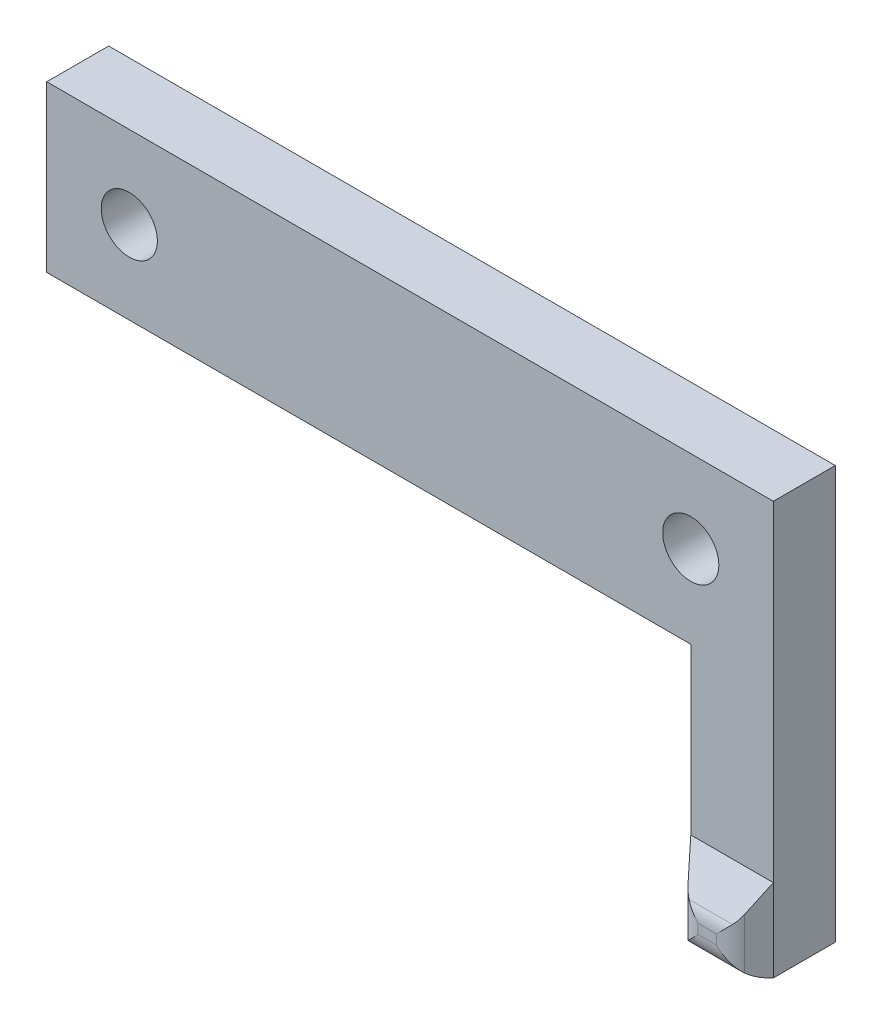
ISO-10303-21;
HEADER;
FILE_DESCRIPTION(('STEP AP214'),'2;1');
FILE_NAME('part.step','',(''),(''),'','','');
FILE_SCHEMA(('AUTOMOTIVE_DESIGN { 1 0 10303 214 1 1 1 1 }'));
ENDSEC;
DATA;
#1=APPLICATION_CONTEXT('core data for automotive mechanical design processes');
#2=APPLICATION_PROTOCOL_DEFINITION('international standard','automotive_design',2000,#1);
#3=PRODUCT_CONTEXT('',#1,'mechanical');
#4=PRODUCT('Part','Part','',(#3));
#5=PRODUCT_RELATED_PRODUCT_CATEGORY('part','',(#4));
#6=PRODUCT_DEFINITION_FORMATION('','',#4);
#7=PRODUCT_DEFINITION_CONTEXT('part definition',#1,'design');
#8=PRODUCT_DEFINITION('design','',#6,#7);
#9=PRODUCT_DEFINITION_SHAPE('','',#8);
#10=(LENGTH_UNIT() NAMED_UNIT(*) SI_UNIT(.MILLI.,.METRE.));
#11=(NAMED_UNIT(*) PLANE_ANGLE_UNIT() SI_UNIT($,.RADIAN.));
#12=(NAMED_UNIT(*) SI_UNIT($,.STERADIAN.) SOLID_ANGLE_UNIT());
#13=UNCERTAINTY_MEASURE_WITH_UNIT(LENGTH_MEASURE(1.E-05),#10,'distance_accuracy_value','');
#14=(GEOMETRIC_REPRESENTATION_CONTEXT(3) GLOBAL_UNCERTAINTY_ASSIGNED_CONTEXT((#13)) GLOBAL_UNIT_ASSIGNED_CONTEXT((#10,
#11,#12)) REPRESENTATION_CONTEXT('',''));
#15=CARTESIAN_POINT('',(0.,0.,0.));
#16=DIRECTION('',(0.,0.,1.));
#17=DIRECTION('',(1.,0.,0.));
#18=AXIS2_PLACEMENT_3D('',#15,#16,#17);
#19=CARTESIAN_POINT('',(78.,-10.,7.5));
#20=DIRECTION('',(0.,1.,0.));
#21=DIRECTION('',(0.,0.,1.));
#22=AXIS2_PLACEMENT_3D('',#19,#20,#21);
#23=PLANE('',#22);
#24=DIRECTION('',(0.,0.,-1.));
#25=VECTOR('',#24,1.);
#26=CARTESIAN_POINT('',(68.,-10.,7.5));
#27=LINE('',#26,#25);
#28=CARTESIAN_POINT('',(68.,-10.,7.5));
#29=VERTEX_POINT('',#28);
#30=CARTESIAN_POINT('',(68.,-10.,0.));
#31=VERTEX_POINT('',#30);
#32=EDGE_CURVE('E238',#29,#31,#27,.T.);
#33=ORIENTED_EDGE('',*,*,#32,.F.);
#34=DIRECTION('',(1.,0.,0.));
#35=VECTOR('',#34,1.);
#36=CARTESIAN_POINT('',(78.,-10.,7.5));
#37=LINE('',#36,#35);
#38=CARTESIAN_POINT('',(-10.,-10.,7.5));
#39=VERTEX_POINT('',#38);
#40=EDGE_CURVE('E161',#39,#29,#37,.T.);
#41=ORIENTED_EDGE('',*,*,#40,.F.);
#42=DIRECTION('',(0.,0.,-1.));
#43=VECTOR('',#42,1.);
#44=CARTESIAN_POINT('',(-10.,-10.,7.5));
#45=LINE('',#44,#43);
#46=CARTESIAN_POINT('',(-10.,-10.,0.));
#47=VERTEX_POINT('',#46);
#48=EDGE_CURVE('E190',#39,#47,#45,.T.);
#49=ORIENTED_EDGE('',*,*,#48,.T.);
#50=DIRECTION('',(1.,0.,0.));
#51=VECTOR('',#50,1.);
#52=CARTESIAN_POINT('',(78.,-10.,0.));
#53=LINE('',#52,#51);
#54=EDGE_CURVE('E259',#47,#31,#53,.T.);
#55=ORIENTED_EDGE('',*,*,#54,.T.);
#56=EDGE_LOOP('',(#33,#41,#49,#55));
#57=FACE_BOUND('',#56,.T.);
#58=ADVANCED_FACE('F47',(#57),#23,.F.);
#59=CARTESIAN_POINT('',(0.,0.,7.5));
#60=DIRECTION('',(0.,0.,-1.));
#61=DIRECTION('',(-1.,0.,0.));
#62=AXIS2_PLACEMENT_3D('',#59,#60,#61);
#63=PLANE('',#62);
#64=DIRECTION('',(0.,1.,0.));
#65=VECTOR('',#64,1.);
#66=CARTESIAN_POINT('',(68.,-40.,7.5));
#67=LINE('',#66,#65);
#68=CARTESIAN_POINT('',(68.,-30.,7.5));
#69=VERTEX_POINT('',#68);
#70=EDGE_CURVE('E157',#69,#29,#67,.T.);
#71=ORIENTED_EDGE('',*,*,#70,.F.);
#72=DIRECTION('',(-1.,0.,0.));
#73=VECTOR('',#72,1.);
#74=CARTESIAN_POINT('',(78.,-30.,7.5));
#75=LINE('',#74,#73);
#76=CARTESIAN_POINT('',(78.,-30.,7.5));
#77=VERTEX_POINT('',#76);
#78=EDGE_CURVE('E138',#77,#69,#75,.T.);
#79=ORIENTED_EDGE('',*,*,#78,.F.);
#80=DIRECTION('',(0.,1.,0.));
#81=VECTOR('',#80,1.);
#82=CARTESIAN_POINT('',(78.,10.,7.5));
#83=LINE('',#82,#81);
#84=CARTESIAN_POINT('',(78.,10.,7.5));
#85=VERTEX_POINT('',#84);
#86=EDGE_CURVE('E186',#77,#85,#83,.T.);
#87=ORIENTED_EDGE('',*,*,#86,.T.);
#88=DIRECTION('',(-1.,0.,0.));
#89=VECTOR('',#88,1.);
#90=CARTESIAN_POINT('',(78.,10.,7.5));
#91=LINE('',#90,#89);
#92=CARTESIAN_POINT('',(-10.,10.,7.5));
#93=VERTEX_POINT('',#92);
#94=EDGE_CURVE('E185',#85,#93,#91,.T.);
#95=ORIENTED_EDGE('',*,*,#94,.T.);
#96=DIRECTION('',(0.,-1.,0.));
#97=VECTOR('',#96,1.);
#98=CARTESIAN_POINT('',(-10.,10.,7.5));
#99=LINE('',#98,#97);
#100=EDGE_CURVE('E256',#93,#39,#99,.T.);
#101=ORIENTED_EDGE('',*,*,#100,.T.);
#102=ORIENTED_EDGE('',*,*,#40,.T.);
#103=EDGE_LOOP('',(#71,#79,#87,#95,#101,#102));
#104=FACE_BOUND('',#103,.T.);
#105=CARTESIAN_POINT('',(0.,0.,7.5));
#106=DIRECTION('',(0.,0.,1.));
#107=DIRECTION('',(1.,0.,0.));
#108=AXIS2_PLACEMENT_3D('',#105,#106,#107);
#109=CIRCLE('',#108,3.4);
#110=CARTESIAN_POINT('',(3.4,0.,7.5));
#111=VERTEX_POINT('',#110);
#112=EDGE_CURVE('E264',#111,#111,#109,.T.);
#113=ORIENTED_EDGE('',*,*,#112,.F.);
#114=EDGE_LOOP('',(#113));
#115=FACE_BOUND('',#114,.T.);
#116=CARTESIAN_POINT('',(68.,0.,7.5));
#117=DIRECTION('',(0.,0.,1.));
#118=DIRECTION('',(1.,0.,0.));
#119=AXIS2_PLACEMENT_3D('',#116,#117,#118);
#120=CIRCLE('',#119,3.4);
#121=CARTESIAN_POINT('',(71.4,0.,7.5));
#122=VERTEX_POINT('',#121);
#123=EDGE_CURVE('E272',#122,#122,#120,.T.);
#124=ORIENTED_EDGE('',*,*,#123,.F.);
#125=EDGE_LOOP('',(#124));
#126=FACE_BOUND('',#125,.T.);
#127=ADVANCED_FACE('F158',(#104,#115,#126),#63,.F.);
#128=CARTESIAN_POINT('',(0.,0.,0.));
#129=DIRECTION('',(0.,0.,-1.));
#130=DIRECTION('',(-1.,0.,0.));
#131=AXIS2_PLACEMENT_3D('',#128,#129,#130);
#132=PLANE('',#131);
#133=CARTESIAN_POINT('',(0.,0.,0.));
#134=DIRECTION('',(0.,0.,1.));
#135=DIRECTION('',(1.,0.,0.));
#136=AXIS2_PLACEMENT_3D('',#133,#134,#135);
#137=CIRCLE('',#136,3.4);
#138=CARTESIAN_POINT('',(3.4,0.,0.));
#139=VERTEX_POINT('',#138);
#140=EDGE_CURVE('E269',#139,#139,#137,.T.);
#141=ORIENTED_EDGE('',*,*,#140,.T.);
#142=EDGE_LOOP('',(#141));
#143=FACE_BOUND('',#142,.T.);
#144=DIRECTION('',(0.,-1.,0.));
#145=VECTOR('',#144,1.);
#146=CARTESIAN_POINT('',(-10.,10.,0.));
#147=LINE('',#146,#145);
#148=CARTESIAN_POINT('',(-10.,10.,0.));
#149=VERTEX_POINT('',#148);
#150=EDGE_CURVE('E261',#149,#47,#147,.T.);
#151=ORIENTED_EDGE('',*,*,#150,.F.);
#152=DIRECTION('',(-1.,0.,0.));
#153=VECTOR('',#152,1.);
#154=CARTESIAN_POINT('',(78.,10.,0.));
#155=LINE('',#154,#153);
#156=CARTESIAN_POINT('',(78.,10.,0.));
#157=VERTEX_POINT('',#156);
#158=EDGE_CURVE('E254',#157,#149,#155,.T.);
#159=ORIENTED_EDGE('',*,*,#158,.F.);
#160=DIRECTION('',(0.,1.,0.));
#161=VECTOR('',#160,1.);
#162=CARTESIAN_POINT('',(78.,10.,0.));
#163=LINE('',#162,#161);
#164=CARTESIAN_POINT('',(78.,-40.,0.));
#165=VERTEX_POINT('',#164);
#166=EDGE_CURVE('E257',#165,#157,#163,.T.);
#167=ORIENTED_EDGE('',*,*,#166,.F.);
#168=DIRECTION('',(1.,0.,0.));
#169=VECTOR('',#168,1.);
#170=CARTESIAN_POINT('',(68.,-40.,0.));
#171=LINE('',#170,#169);
#172=CARTESIAN_POINT('',(68.,-40.,0.));
#173=VERTEX_POINT('',#172);
#174=EDGE_CURVE('E236',#173,#165,#171,.T.);
#175=ORIENTED_EDGE('',*,*,#174,.F.);
#176=DIRECTION('',(0.,1.,0.));
#177=VECTOR('',#176,1.);
#178=CARTESIAN_POINT('',(68.,-40.,0.));
#179=LINE('',#178,#177);
#180=EDGE_CURVE('E171',#173,#31,#179,.T.);
#181=ORIENTED_EDGE('',*,*,#180,.T.);
#182=ORIENTED_EDGE('',*,*,#54,.F.);
#183=EDGE_LOOP('',(#151,#159,#167,#175,#181,#182));
#184=FACE_BOUND('',#183,.T.);
#185=CARTESIAN_POINT('',(68.,0.,0.));
#186=DIRECTION('',(0.,0.,1.));
#187=DIRECTION('',(1.,0.,0.));
#188=AXIS2_PLACEMENT_3D('',#185,#186,#187);
#189=CIRCLE('',#188,3.4);
#190=CARTESIAN_POINT('',(71.4,0.,0.));
#191=VERTEX_POINT('',#190);
#192=EDGE_CURVE('E174',#191,#191,#189,.T.);
#193=ORIENTED_EDGE('',*,*,#192,.T.);
#194=EDGE_LOOP('',(#193));
#195=FACE_BOUND('',#194,.T.);
#196=ADVANCED_FACE('F283',(#143,#184,#195),#132,.T.);
#197=CARTESIAN_POINT('',(-10.,10.,7.5));
#198=DIRECTION('',(1.,0.,0.));
#199=DIRECTION('',(0.,0.,-1.));
#200=AXIS2_PLACEMENT_3D('',#197,#198,#199);
#201=PLANE('',#200);
#202=ORIENTED_EDGE('',*,*,#150,.T.);
#203=ORIENTED_EDGE('',*,*,#48,.F.);
#204=ORIENTED_EDGE('',*,*,#100,.F.);
#205=DIRECTION('',(0.,0.,-1.));
#206=VECTOR('',#205,1.);
#207=CARTESIAN_POINT('',(-10.,10.,7.5));
#208=LINE('',#207,#206);
#209=EDGE_CURVE('E251',#93,#149,#208,.T.);
#210=ORIENTED_EDGE('',*,*,#209,.T.);
#211=EDGE_LOOP('',(#202,#203,#204,#210));
#212=FACE_BOUND('',#211,.T.);
#213=ADVANCED_FACE('F289',(#212),#201,.F.);
#214=CARTESIAN_POINT('',(78.,10.,7.5));
#215=DIRECTION('',(-1.,0.,0.));
#216=DIRECTION('',(0.,0.,1.));
#217=AXIS2_PLACEMENT_3D('',#214,#215,#216);
#218=PLANE('',#217);
#219=ORIENTED_EDGE('',*,*,#166,.T.);
#220=DIRECTION('',(0.,0.,-1.));
#221=VECTOR('',#220,1.);
#222=CARTESIAN_POINT('',(78.,10.,7.5));
#223=LINE('',#222,#221);
#224=EDGE_CURVE('E248',#85,#157,#223,.T.);
#225=ORIENTED_EDGE('',*,*,#224,.F.);
#226=ORIENTED_EDGE('',*,*,#86,.F.);
#227=DIRECTION('',(0.,1.,0.));
#228=VECTOR('',#227,1.);
#229=CARTESIAN_POINT('',(78.,0.,7.5));
#230=LINE('',#229,#228);
#231=CARTESIAN_POINT('',(78.,-40.,7.5));
#232=VERTEX_POINT('',#231);
#233=EDGE_CURVE('E183',#232,#77,#230,.T.);
#234=ORIENTED_EDGE('',*,*,#233,.F.);
#235=DIRECTION('',(0.,0.,1.));
#236=VECTOR('',#235,1.);
#237=CARTESIAN_POINT('',(78.,-40.,0.));
#238=LINE('',#237,#236);
#239=EDGE_CURVE('E165',#165,#232,#238,.T.);
#240=ORIENTED_EDGE('',*,*,#239,.F.);
#241=EDGE_LOOP('',(#219,#225,#226,#234,#240));
#242=FACE_BOUND('',#241,.T.);
#243=ADVANCED_FACE('F231',(#242),#218,.F.);
#244=CARTESIAN_POINT('',(78.,10.,7.5));
#245=DIRECTION('',(0.,-1.,0.));
#246=DIRECTION('',(0.,0.,-1.));
#247=AXIS2_PLACEMENT_3D('',#244,#245,#246);
#248=PLANE('',#247);
#249=ORIENTED_EDGE('',*,*,#158,.T.);
#250=ORIENTED_EDGE('',*,*,#209,.F.);
#251=ORIENTED_EDGE('',*,*,#94,.F.);
#252=ORIENTED_EDGE('',*,*,#224,.T.);
#253=EDGE_LOOP('',(#249,#250,#251,#252));
#254=FACE_BOUND('',#253,.T.);
#255=ADVANCED_FACE('F298',(#254),#248,.F.);
#256=CARTESIAN_POINT('',(0.,0.,7.5));
#257=DIRECTION('',(0.,0.,-1.));
#258=DIRECTION('',(-1.,0.,0.));
#259=AXIS2_PLACEMENT_3D('',#256,#257,#258);
#260=CYLINDRICAL_SURFACE('',#259,3.4);
#261=ORIENTED_EDGE('',*,*,#112,.T.);
#262=EDGE_LOOP('',(#261));
#263=FACE_BOUND('',#262,.T.);
#264=ORIENTED_EDGE('',*,*,#140,.F.);
#265=EDGE_LOOP('',(#264));
#266=FACE_BOUND('',#265,.T.);
#267=ADVANCED_FACE('F295',(#263,#266),#260,.F.);
#268=CARTESIAN_POINT('',(68.,0.,7.5));
#269=DIRECTION('',(0.,0.,-1.));
#270=DIRECTION('',(-1.,0.,0.));
#271=AXIS2_PLACEMENT_3D('',#268,#269,#270);
#272=CYLINDRICAL_SURFACE('',#271,3.4);
#273=ORIENTED_EDGE('',*,*,#123,.T.);
#274=EDGE_LOOP('',(#273));
#275=FACE_BOUND('',#274,.T.);
#276=ORIENTED_EDGE('',*,*,#192,.F.);
#277=EDGE_LOOP('',(#276));
#278=FACE_BOUND('',#277,.T.);
#279=ADVANCED_FACE('F279',(#275,#278),#272,.F.);
#280=CARTESIAN_POINT('',(68.,-40.,7.5));
#281=DIRECTION('',(1.,0.,0.));
#282=DIRECTION('',(0.,0.,-1.));
#283=AXIS2_PLACEMENT_3D('',#280,#281,#282);
#284=PLANE('',#283);
#285=ORIENTED_EDGE('',*,*,#32,.T.);
#286=ORIENTED_EDGE('',*,*,#180,.F.);
#287=DIRECTION('',(0.,0.,-1.));
#288=VECTOR('',#287,1.);
#289=CARTESIAN_POINT('',(68.,-40.,7.5));
#290=LINE('',#289,#288);
#291=CARTESIAN_POINT('',(68.,-40.,7.5));
#292=VERTEX_POINT('',#291);
#293=EDGE_CURVE('E170',#292,#173,#290,.T.);
#294=ORIENTED_EDGE('',*,*,#293,.F.);
#295=DIRECTION('',(0.,1.,0.));
#296=VECTOR('',#295,1.);
#297=CARTESIAN_POINT('',(68.,-40.,7.5));
#298=LINE('',#297,#296);
#299=EDGE_CURVE('E152',#292,#69,#298,.T.);
#300=ORIENTED_EDGE('',*,*,#299,.T.);
#301=ORIENTED_EDGE('',*,*,#70,.T.);
#302=EDGE_LOOP('',(#285,#286,#294,#300,#301));
#303=FACE_BOUND('',#302,.T.);
#304=ADVANCED_FACE('F167',(#303),#284,.F.);
#305=CARTESIAN_POINT('',(0.,-40.,0.));
#306=DIRECTION('',(0.,-1.,0.));
#307=DIRECTION('',(0.,0.,-1.));
#308=AXIS2_PLACEMENT_3D('',#305,#306,#307);
#309=PLANE('',#308);
#310=ORIENTED_EDGE('',*,*,#239,.T.);
#311=DIRECTION('',(1.,0.,0.));
#312=VECTOR('',#311,1.);
#313=CARTESIAN_POINT('',(70.5,-40.,7.5));
#314=LINE('',#313,#312);
#315=EDGE_CURVE('E206',#232,#292,#314,.F.);
#316=ORIENTED_EDGE('',*,*,#315,.T.);
#317=ORIENTED_EDGE('',*,*,#293,.T.);
#318=ORIENTED_EDGE('',*,*,#174,.T.);
#319=EDGE_LOOP('',(#310,#316,#317,#318));
#320=FACE_BOUND('',#319,.T.);
#321=ADVANCED_FACE('F235',(#320),#309,.T.);
#322=CARTESIAN_POINT('',(0.,0.,10.5));
#323=DIRECTION('',(0.,0.,-1.));
#324=DIRECTION('',(-1.,0.,0.));
#325=AXIS2_PLACEMENT_3D('',#322,#323,#324);
#326=PLANE('',#325);
#327=DIRECTION('',(0.,1.,0.));
#328=VECTOR('',#327,1.);
#329=CARTESIAN_POINT('',(74.0948751620467,0.,10.5));
#330=LINE('',#329,#328);
#331=CARTESIAN_POINT('',(74.0948751620467,-37.,10.5));
#332=VERTEX_POINT('',#331);
#333=CARTESIAN_POINT('',(74.0948751620467,-35.8309518948453,10.5));
#334=VERTEX_POINT('',#333);
#335=EDGE_CURVE('E192',#332,#334,#330,.T.);
#336=ORIENTED_EDGE('',*,*,#335,.T.);
#337=DIRECTION('',(-1.,0.,0.));
#338=VECTOR('',#337,1.);
#339=CARTESIAN_POINT('',(0.,-35.8309518948454,10.5));
#340=LINE('',#339,#338);
#341=CARTESIAN_POINT('',(71.9051248379533,-35.8309518948453,10.5));
#342=VERTEX_POINT('',#341);
#343=EDGE_CURVE('E194',#334,#342,#340,.T.);
#344=ORIENTED_EDGE('',*,*,#343,.T.);
#345=DIRECTION('',(0.,-1.,0.));
#346=VECTOR('',#345,1.);
#347=CARTESIAN_POINT('',(71.9051248379533,0.,10.5));
#348=LINE('',#347,#346);
#349=CARTESIAN_POINT('',(71.9051248379533,-37.,10.5));
#350=VERTEX_POINT('',#349);
#351=EDGE_CURVE('E187',#342,#350,#348,.T.);
#352=ORIENTED_EDGE('',*,*,#351,.T.);
#353=DIRECTION('',(1.,0.,0.));
#354=VECTOR('',#353,1.);
#355=CARTESIAN_POINT('',(75.5,-37.,10.5));
#356=LINE('',#355,#354);
#357=EDGE_CURVE('E189',#350,#332,#356,.T.);
#358=ORIENTED_EDGE('',*,*,#357,.T.);
#359=EDGE_LOOP('',(#336,#344,#352,#358));
#360=FACE_BOUND('',#359,.T.);
#361=ADVANCED_FACE('F327',(#360),#326,.F.);
#362=CARTESIAN_POINT('',(36.4426229508198,0.,-30.3688524590164));
#363=DIRECTION('',(0.768221279597377,0.,-0.640184399664478));
#364=DIRECTION('',(-0.640184399664478,0.,-0.768221279597377));
#365=AXIS2_PLACEMENT_3D('',#362,#363,#364);
#366=PLANE('',#365);
#367=ORIENTED_EDGE('',*,*,#299,.F.);
#368=CARTESIAN_POINT('',(68.,-37.,7.5));
#369=DIRECTION('',(0.768221279597377,0.,-0.640184399664478));
#370=DIRECTION('',(-0.640184399664478,0.,-0.768221279597377));
#371=AXIS2_PLACEMENT_3D('',#368,#369,#370);
#372=ELLIPSE('',#371,3.90512483795332,3.);
#373=CARTESIAN_POINT('',(69.6004609991612,-39.3046638387921,9.42055319899343));
#374=VERTEX_POINT('',#373);
#375=EDGE_CURVE('E12',#292,#374,#372,.F.);
#376=ORIENTED_EDGE('',*,*,#375,.T.);
#377=DIRECTION('',(0.,-1.,0.));
#378=VECTOR('',#377,1.);
#379=CARTESIAN_POINT('',(69.6004609991612,0.,9.42055319899343));
#380=LINE('',#379,#378);
#381=CARTESIAN_POINT('',(69.6004609991612,-33.2009219983224,9.42055319899344));
#382=VERTEX_POINT('',#381);
#383=EDGE_CURVE('E56',#374,#382,#380,.F.);
#384=ORIENTED_EDGE('',*,*,#383,.T.);
#385=DIRECTION('',(0.394055203119551,-0.7881104062391,0.47286624374346));
#386=VECTOR('',#385,1.);
#387=CARTESIAN_POINT('',(68.,-30.,7.5));
#388=LINE('',#387,#386);
#389=EDGE_CURVE('E142',#69,#382,#388,.T.);
#390=ORIENTED_EDGE('',*,*,#389,.F.);
#391=EDGE_LOOP('',(#367,#376,#384,#390));
#392=FACE_BOUND('',#391,.T.);
#393=ADVANCED_FACE('F150',(#392),#366,.F.);
#394=CARTESIAN_POINT('',(0.,-4.63235294117649,-7.72058823529416));
#395=DIRECTION('',(0.,-0.514495755427526,-0.857492925712544));
#396=DIRECTION('',(0.,0.857492925712544,-0.514495755427526));
#397=AXIS2_PLACEMENT_3D('',#394,#395,#396);
#398=PLANE('',#397);
#399=DIRECTION('',(-1.,0.,0.));
#400=VECTOR('',#399,1.);
#401=CARTESIAN_POINT('',(0.,-34.2874646285628,10.0724787771376));
#402=LINE('',#401,#400);
#403=CARTESIAN_POINT('',(70.3616375716707,-34.2874646285627,10.0724787771376));
#404=VERTEX_POINT('',#403);
#405=CARTESIAN_POINT('',(75.6383624283293,-34.2874646285627,10.0724787771376));
#406=VERTEX_POINT('',#405);
#407=EDGE_CURVE('E199',#404,#406,#402,.F.);
#408=ORIENTED_EDGE('',*,*,#407,.T.);
#409=CARTESIAN_POINT('',(74.0948751620467,-30.,7.5));
#410=DIRECTION('',(0.,-0.514495755427526,-0.857492925712544));
#411=DIRECTION('',(0.,0.857492925712544,-0.514495755427526));
#412=AXIS2_PLACEMENT_3D('',#409,#410,#411);
#413=ELLIPSE('',#412,5.8309518948453,3.);
#414=CARTESIAN_POINT('',(76.3995390008388,-33.2009219983224,9.42055319899344));
#415=VERTEX_POINT('',#414);
#416=EDGE_CURVE('E201',#406,#415,#413,.F.);
#417=ORIENTED_EDGE('',*,*,#416,.T.);
#418=DIRECTION('',(-0.394055203119551,-0.7881104062391,0.472866243743461));
#419=VECTOR('',#418,1.);
#420=CARTESIAN_POINT('',(78.,-30.,7.5));
#421=LINE('',#420,#419);
#422=EDGE_CURVE('E144',#77,#415,#421,.T.);
#423=ORIENTED_EDGE('',*,*,#422,.F.);
#424=ORIENTED_EDGE('',*,*,#78,.T.);
#425=ORIENTED_EDGE('',*,*,#389,.T.);
#426=CARTESIAN_POINT('',(71.9051248379533,-30.,7.5));
#427=DIRECTION('',(0.,-0.514495755427526,-0.857492925712544));
#428=DIRECTION('',(0.,-0.857492925712544,0.514495755427526));
#429=AXIS2_PLACEMENT_3D('',#426,#427,#428);
#430=ELLIPSE('',#429,5.8309518948453,3.);
#431=EDGE_CURVE('E197',#382,#404,#430,.F.);
#432=ORIENTED_EDGE('',*,*,#431,.T.);
#433=EDGE_LOOP('',(#408,#417,#423,#424,#425,#432));
#434=FACE_BOUND('',#433,.T.);
#435=ADVANCED_FACE('F141',(#434),#398,.F.);
#436=CARTESIAN_POINT('',(49.7213114754098,0.,41.4344262295082));
#437=DIRECTION('',(-0.768221279597376,0.,-0.64018439966448));
#438=DIRECTION('',(-0.64018439966448,0.,0.768221279597376));
#439=AXIS2_PLACEMENT_3D('',#436,#437,#438);
#440=PLANE('',#439);
#441=ORIENTED_EDGE('',*,*,#422,.T.);
#442=DIRECTION('',(0.,1.,0.));
#443=VECTOR('',#442,1.);
#444=CARTESIAN_POINT('',(76.3995390008388,0.,9.42055319899344));
#445=LINE('',#444,#443);
#446=CARTESIAN_POINT('',(76.3995390008388,-39.3046638387921,9.42055319899344));
#447=VERTEX_POINT('',#446);
#448=EDGE_CURVE('E70',#415,#447,#445,.F.);
#449=ORIENTED_EDGE('',*,*,#448,.T.);
#450=CARTESIAN_POINT('',(78.,-37.,7.5));
#451=DIRECTION('',(-0.768221279597376,0.,-0.64018439966448));
#452=DIRECTION('',(-0.64018439966448,0.,0.768221279597376));
#453=AXIS2_PLACEMENT_3D('',#450,#451,#452);
#454=ELLIPSE('',#453,3.90512483795333,3.);
#455=EDGE_CURVE('E203',#447,#232,#454,.F.);
#456=ORIENTED_EDGE('',*,*,#455,.T.);
#457=ORIENTED_EDGE('',*,*,#233,.T.);
#458=EDGE_LOOP('',(#441,#449,#456,#457));
#459=FACE_BOUND('',#458,.T.);
#460=ADVANCED_FACE('F227',(#459),#440,.F.);
#461=CARTESIAN_POINT('',(0.,-37.,7.5));
#462=DIRECTION('',(-1.,0.,0.));
#463=DIRECTION('',(0.,0.,1.));
#464=AXIS2_PLACEMENT_3D('',#461,#462,#463);
#465=CYLINDRICAL_SURFACE('',#464,3.);
#466=ORIENTED_EDGE('',*,*,#315,.F.);
#467=ORIENTED_EDGE('',*,*,#455,.F.);
#468=CARTESIAN_POINT('',(74.0948751620467,-37.,7.5));
#469=DIRECTION('',(-0.707106781186547,-0.707106781186548,0.));
#470=DIRECTION('',(-0.707106781186547,0.707106781186547,0.));
#471=AXIS2_PLACEMENT_3D('',#468,#469,#470);
#472=ELLIPSE('',#471,4.24264068711929,3.);
#473=EDGE_CURVE('E51',#332,#447,#472,.F.);
#474=ORIENTED_EDGE('',*,*,#473,.F.);
#475=ORIENTED_EDGE('',*,*,#357,.F.);
#476=CARTESIAN_POINT('',(71.9051248379533,-37.,7.5));
#477=DIRECTION('',(0.707106781186547,-0.707106781186547,0.));
#478=DIRECTION('',(-0.707106781186547,-0.707106781186547,0.));
#479=AXIS2_PLACEMENT_3D('',#476,#477,#478);
#480=ELLIPSE('',#479,4.24264068711928,3.);
#481=EDGE_CURVE('E212',#374,#350,#480,.F.);
#482=ORIENTED_EDGE('',*,*,#481,.F.);
#483=ORIENTED_EDGE('',*,*,#375,.F.);
#484=EDGE_LOOP('',(#466,#467,#474,#475,#482,#483));
#485=FACE_BOUND('',#484,.T.);
#486=ADVANCED_FACE('F49',(#485),#465,.T.);
#487=CARTESIAN_POINT('',(74.0948751620467,0.,7.5));
#488=DIRECTION('',(0.,1.,0.));
#489=DIRECTION('',(-1.,0.,0.));
#490=AXIS2_PLACEMENT_3D('',#487,#488,#489);
#491=CYLINDRICAL_SURFACE('',#490,3.);
#492=ORIENTED_EDGE('',*,*,#448,.F.);
#493=ORIENTED_EDGE('',*,*,#416,.F.);
#494=CARTESIAN_POINT('',(74.0948751620467,-35.8309518948453,7.5));
#495=DIRECTION('',(-0.707106781186548,0.707106781186547,0.));
#496=DIRECTION('',(0.707106781186547,0.707106781186548,0.));
#497=AXIS2_PLACEMENT_3D('',#494,#495,#496);
#498=ELLIPSE('',#497,4.24264068711929,3.);
#499=EDGE_CURVE('E211',#334,#406,#498,.T.);
#500=ORIENTED_EDGE('',*,*,#499,.F.);
#501=ORIENTED_EDGE('',*,*,#335,.F.);
#502=ORIENTED_EDGE('',*,*,#473,.T.);
#503=EDGE_LOOP('',(#492,#493,#500,#501,#502));
#504=FACE_BOUND('',#503,.T.);
#505=ADVANCED_FACE('F220',(#504),#491,.T.);
#506=CARTESIAN_POINT('',(71.9051248379533,0.,7.5));
#507=DIRECTION('',(0.,-1.,0.));
#508=DIRECTION('',(0.,0.,-1.));
#509=AXIS2_PLACEMENT_3D('',#506,#507,#508);
#510=CYLINDRICAL_SURFACE('',#509,3.);
#511=ORIENTED_EDGE('',*,*,#481,.T.);
#512=ORIENTED_EDGE('',*,*,#351,.F.);
#513=CARTESIAN_POINT('',(71.9051248379533,-35.8309518948453,7.5));
#514=DIRECTION('',(-0.707106781186547,-0.707106781186548,0.));
#515=DIRECTION('',(0.707106781186548,-0.707106781186547,0.));
#516=AXIS2_PLACEMENT_3D('',#513,#514,#515);
#517=ELLIPSE('',#516,4.24264068711928,3.);
#518=EDGE_CURVE('E209',#404,#342,#517,.F.);
#519=ORIENTED_EDGE('',*,*,#518,.F.);
#520=ORIENTED_EDGE('',*,*,#431,.F.);
#521=ORIENTED_EDGE('',*,*,#383,.F.);
#522=EDGE_LOOP('',(#511,#512,#519,#520,#521));
#523=FACE_BOUND('',#522,.T.);
#524=ADVANCED_FACE('F310',(#523),#510,.T.);
#525=CARTESIAN_POINT('',(0.,-35.8309518948454,7.5));
#526=DIRECTION('',(-1.,0.,0.));
#527=DIRECTION('',(0.,-1.,0.));
#528=AXIS2_PLACEMENT_3D('',#525,#526,#527);
#529=CYLINDRICAL_SURFACE('',#528,3.);
#530=ORIENTED_EDGE('',*,*,#499,.T.);
#531=ORIENTED_EDGE('',*,*,#407,.F.);
#532=ORIENTED_EDGE('',*,*,#518,.T.);
#533=ORIENTED_EDGE('',*,*,#343,.F.);
#534=EDGE_LOOP('',(#530,#531,#532,#533));
#535=FACE_BOUND('',#534,.T.);
#536=ADVANCED_FACE('F307',(#535),#529,.T.);
#537=CLOSED_SHELL('',(#58,#127,#196,#213,#243,#255,#267,#279,#304,#321,#361,#393,#435,#460,#486,
#505,#524,#536));
#538=MANIFOLD_SOLID_BREP('B2',#537);
#539=ADVANCED_BREP_SHAPE_REPRESENTATION('',(#18,#538),#14);
#540=SHAPE_DEFINITION_REPRESENTATION(#9,#539);
ENDSEC;
END-ISO-10303-21;
